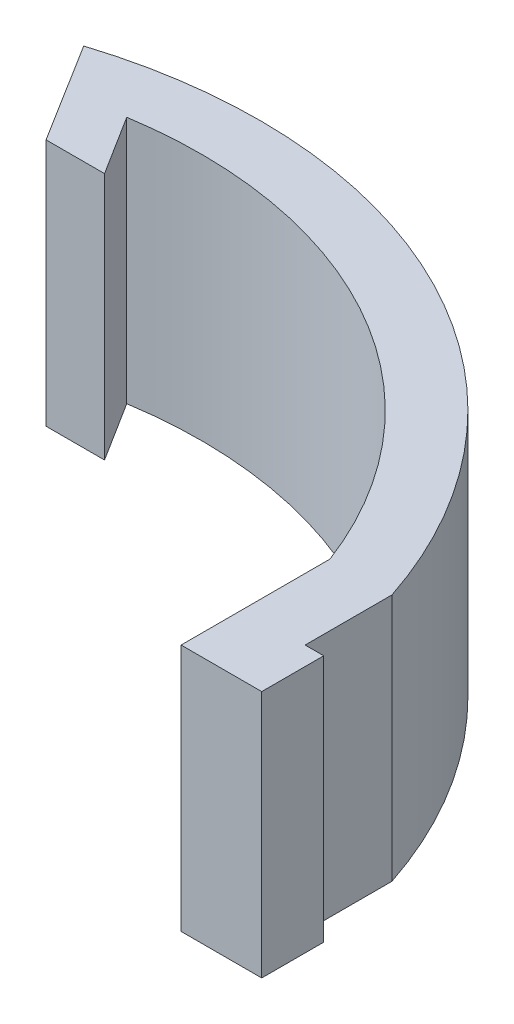
ISO-10303-21;
HEADER;
FILE_DESCRIPTION(('STEP AP214'),'2;1');
FILE_NAME('part.step','',(''),(''),'','','');
FILE_SCHEMA(('AUTOMOTIVE_DESIGN { 1 0 10303 214 1 1 1 1 }'));
ENDSEC;
DATA;
#1=APPLICATION_CONTEXT('core data for automotive mechanical design processes');
#2=APPLICATION_PROTOCOL_DEFINITION('international standard','automotive_design',2000,#1);
#3=PRODUCT_CONTEXT('',#1,'mechanical');
#4=PRODUCT('Part','Part','',(#3));
#5=PRODUCT_RELATED_PRODUCT_CATEGORY('part','',(#4));
#6=PRODUCT_DEFINITION_FORMATION('','',#4);
#7=PRODUCT_DEFINITION_CONTEXT('part definition',#1,'design');
#8=PRODUCT_DEFINITION('design','',#6,#7);
#9=PRODUCT_DEFINITION_SHAPE('','',#8);
#10=(LENGTH_UNIT() NAMED_UNIT(*) SI_UNIT(.MILLI.,.METRE.));
#11=(NAMED_UNIT(*) PLANE_ANGLE_UNIT() SI_UNIT($,.RADIAN.));
#12=(NAMED_UNIT(*) SI_UNIT($,.STERADIAN.) SOLID_ANGLE_UNIT());
#13=UNCERTAINTY_MEASURE_WITH_UNIT(LENGTH_MEASURE(1.E-05),#10,'distance_accuracy_value','');
#14=(GEOMETRIC_REPRESENTATION_CONTEXT(3) GLOBAL_UNCERTAINTY_ASSIGNED_CONTEXT((#13)) GLOBAL_UNIT_ASSIGNED_CONTEXT((#10,
#11,#12)) REPRESENTATION_CONTEXT('',''));
#15=CARTESIAN_POINT('',(0.,0.,0.));
#16=DIRECTION('',(0.,0.,1.));
#17=DIRECTION('',(1.,0.,0.));
#18=AXIS2_PLACEMENT_3D('',#15,#16,#17);
#19=CARTESIAN_POINT('',(13.3217647859869,10.,10.0821639100573));
#20=DIRECTION('',(-1.,0.,0.));
#21=DIRECTION('',(0.,0.,1.));
#22=AXIS2_PLACEMENT_3D('',#19,#20,#21);
#23=PLANE('',#22);
#24=DIRECTION('',(0.,0.,-1.));
#25=VECTOR('',#24,1.);
#26=CARTESIAN_POINT('',(13.3217647859869,0.,10.0821639100573));
#27=LINE('',#26,#25);
#28=CARTESIAN_POINT('',(13.3217647859869,0.,10.0821639100573));
#29=VERTEX_POINT('',#28);
#30=CARTESIAN_POINT('',(13.3217647859869,0.,7.58216391005735));
#31=VERTEX_POINT('',#30);
#32=EDGE_CURVE('E145',#29,#31,#27,.T.);
#33=ORIENTED_EDGE('',*,*,#32,.T.);
#34=DIRECTION('',(0.,-1.,0.));
#35=VECTOR('',#34,1.);
#36=CARTESIAN_POINT('',(13.3217647859869,10.,7.58216391005735));
#37=LINE('',#36,#35);
#38=CARTESIAN_POINT('',(13.3217647859869,10.,7.58216391005735));
#39=VERTEX_POINT('',#38);
#40=EDGE_CURVE('E41',#39,#31,#37,.T.);
#41=ORIENTED_EDGE('',*,*,#40,.F.);
#42=DIRECTION('',(0.,0.,-1.));
#43=VECTOR('',#42,1.);
#44=CARTESIAN_POINT('',(13.3217647859869,10.,10.0821639100573));
#45=LINE('',#44,#43);
#46=CARTESIAN_POINT('',(13.3217647859869,10.,10.0821639100573));
#47=VERTEX_POINT('',#46);
#48=EDGE_CURVE('E99',#47,#39,#45,.T.);
#49=ORIENTED_EDGE('',*,*,#48,.F.);
#50=DIRECTION('',(0.,-1.,0.));
#51=VECTOR('',#50,1.);
#52=CARTESIAN_POINT('',(13.3217647859869,10.,10.0821639100573));
#53=LINE('',#52,#51);
#54=EDGE_CURVE('E11',#47,#29,#53,.T.);
#55=ORIENTED_EDGE('',*,*,#54,.T.);
#56=EDGE_LOOP('',(#33,#41,#49,#55));
#57=FACE_BOUND('',#56,.T.);
#58=ADVANCED_FACE('F33',(#57),#23,.F.);
#59=CARTESIAN_POINT('',(12.5717647859869,10.,7.58216391005735));
#60=DIRECTION('',(0.,0.,1.));
#61=DIRECTION('',(1.,0.,0.));
#62=AXIS2_PLACEMENT_3D('',#59,#60,#61);
#63=PLANE('',#62);
#64=DIRECTION('',(-1.,0.,0.));
#65=VECTOR('',#64,1.);
#66=CARTESIAN_POINT('',(12.5717647859869,0.,7.58216391005735));
#67=LINE('',#66,#65);
#68=CARTESIAN_POINT('',(12.5717647859869,0.,7.58216391005735));
#69=VERTEX_POINT('',#68);
#70=EDGE_CURVE('E147',#31,#69,#67,.T.);
#71=ORIENTED_EDGE('',*,*,#70,.T.);
#72=DIRECTION('',(0.,-1.,0.));
#73=VECTOR('',#72,1.);
#74=CARTESIAN_POINT('',(12.5717647859869,10.,7.58216391005735));
#75=LINE('',#74,#73);
#76=CARTESIAN_POINT('',(12.5717647859869,10.,7.58216391005735));
#77=VERTEX_POINT('',#76);
#78=EDGE_CURVE('E174',#77,#69,#75,.T.);
#79=ORIENTED_EDGE('',*,*,#78,.F.);
#80=DIRECTION('',(-1.,0.,0.));
#81=VECTOR('',#80,1.);
#82=CARTESIAN_POINT('',(12.5717647859869,10.,7.58216391005735));
#83=LINE('',#82,#81);
#84=EDGE_CURVE('E182',#39,#77,#83,.T.);
#85=ORIENTED_EDGE('',*,*,#84,.F.);
#86=ORIENTED_EDGE('',*,*,#40,.T.);
#87=EDGE_LOOP('',(#71,#79,#85,#86));
#88=FACE_BOUND('',#87,.T.);
#89=ADVANCED_FACE('F180',(#88),#63,.F.);
#90=CARTESIAN_POINT('',(12.5717647859869,10.,4.08216391005735));
#91=DIRECTION('',(-1.,0.,0.));
#92=DIRECTION('',(0.,0.,1.));
#93=AXIS2_PLACEMENT_3D('',#90,#91,#92);
#94=PLANE('',#93);
#95=DIRECTION('',(0.,0.,-1.));
#96=VECTOR('',#95,1.);
#97=CARTESIAN_POINT('',(12.5717647859869,0.,4.08216391005735));
#98=LINE('',#97,#96);
#99=CARTESIAN_POINT('',(12.5717647859869,0.,4.08216391005735));
#100=VERTEX_POINT('',#99);
#101=EDGE_CURVE('E149',#69,#100,#98,.T.);
#102=ORIENTED_EDGE('',*,*,#101,.T.);
#103=DIRECTION('',(0.,-1.,0.));
#104=VECTOR('',#103,1.);
#105=CARTESIAN_POINT('',(12.5717647859869,10.,4.08216391005735));
#106=LINE('',#105,#104);
#107=CARTESIAN_POINT('',(12.5717647859869,10.,4.08216391005735));
#108=VERTEX_POINT('',#107);
#109=EDGE_CURVE('E171',#108,#100,#106,.T.);
#110=ORIENTED_EDGE('',*,*,#109,.F.);
#111=DIRECTION('',(0.,0.,-1.));
#112=VECTOR('',#111,1.);
#113=CARTESIAN_POINT('',(12.5717647859869,10.,4.08216391005735));
#114=LINE('',#113,#112);
#115=EDGE_CURVE('E201',#77,#108,#114,.T.);
#116=ORIENTED_EDGE('',*,*,#115,.F.);
#117=ORIENTED_EDGE('',*,*,#78,.T.);
#118=EDGE_LOOP('',(#102,#110,#116,#117));
#119=FACE_BOUND('',#118,.T.);
#120=ADVANCED_FACE('F192',(#119),#94,.F.);
#121=CARTESIAN_POINT('',(-6.65788081712317,10.,10.4244242594253));
#122=DIRECTION('',(0.,-1.,0.));
#123=DIRECTION('',(0.,0.,-1.));
#124=AXIS2_PLACEMENT_3D('',#121,#122,#123);
#125=CYLINDRICAL_SURFACE('',#124,20.2485440553235);
#126=CARTESIAN_POINT('',(-6.65788081712317,0.,10.4244242594253));
#127=DIRECTION('',(0.,1.,0.));
#128=DIRECTION('',(0.,0.,1.));
#129=AXIS2_PLACEMENT_3D('',#126,#127,#128);
#130=CIRCLE('',#129,20.2485440553235);
#131=CARTESIAN_POINT('',(-12.8056765576685,0.,-8.86827238704966));
#132=VERTEX_POINT('',#131);
#133=EDGE_CURVE('E151',#100,#132,#130,.T.);
#134=ORIENTED_EDGE('',*,*,#133,.T.);
#135=DIRECTION('',(0.,-1.,0.));
#136=VECTOR('',#135,1.);
#137=CARTESIAN_POINT('',(-12.8056765576685,10.,-8.86827238704966));
#138=LINE('',#137,#136);
#139=CARTESIAN_POINT('',(-12.8056765576685,10.,-8.86827238704966));
#140=VERTEX_POINT('',#139);
#141=EDGE_CURVE('E168',#140,#132,#138,.T.);
#142=ORIENTED_EDGE('',*,*,#141,.F.);
#143=CARTESIAN_POINT('',(-6.65788081712317,10.,10.4244242594253));
#144=DIRECTION('',(0.,1.,0.));
#145=DIRECTION('',(0.,0.,1.));
#146=AXIS2_PLACEMENT_3D('',#143,#144,#145);
#147=CIRCLE('',#146,20.2485440553235);
#148=EDGE_CURVE('E198',#108,#140,#147,.T.);
#149=ORIENTED_EDGE('',*,*,#148,.F.);
#150=ORIENTED_EDGE('',*,*,#109,.T.);
#151=EDGE_LOOP('',(#134,#142,#149,#150));
#152=FACE_BOUND('',#151,.T.);
#153=ADVANCED_FACE('F196',(#152),#125,.T.);
#154=CARTESIAN_POINT('',(-10.2875702585536,10.,-4.83354103018319));
#155=DIRECTION('',(0.848338398998803,0.,-0.529454399154589));
#156=DIRECTION('',(-0.529454399154589,0.,-0.848338398998803));
#157=AXIS2_PLACEMENT_3D('',#154,#155,#156);
#158=PLANE('',#157);
#159=DIRECTION('',(0.529454399154589,0.,0.848338398998803));
#160=VECTOR('',#159,1.);
#161=CARTESIAN_POINT('',(-10.2875702585536,0.,-4.83354103018319));
#162=LINE('',#161,#160);
#163=CARTESIAN_POINT('',(-10.2875702585536,0.,-4.83354103018319));
#164=VERTEX_POINT('',#163);
#165=EDGE_CURVE('E153',#132,#164,#162,.T.);
#166=ORIENTED_EDGE('',*,*,#165,.T.);
#167=DIRECTION('',(0.,-1.,0.));
#168=VECTOR('',#167,1.);
#169=CARTESIAN_POINT('',(-10.2875702585536,10.,-4.83354103018319));
#170=LINE('',#169,#168);
#171=CARTESIAN_POINT('',(-10.2875702585536,10.,-4.83354103018319));
#172=VERTEX_POINT('',#171);
#173=EDGE_CURVE('E165',#172,#164,#170,.T.);
#174=ORIENTED_EDGE('',*,*,#173,.F.);
#175=DIRECTION('',(0.529454399154589,0.,0.848338398998803));
#176=VECTOR('',#175,1.);
#177=CARTESIAN_POINT('',(-10.2875702585536,10.,-4.83354103018319));
#178=LINE('',#177,#176);
#179=EDGE_CURVE('E200',#140,#172,#178,.T.);
#180=ORIENTED_EDGE('',*,*,#179,.F.);
#181=ORIENTED_EDGE('',*,*,#141,.T.);
#182=EDGE_LOOP('',(#166,#174,#180,#181));
#183=FACE_BOUND('',#182,.T.);
#184=ADVANCED_FACE('F220',(#183),#158,.F.);
#185=CARTESIAN_POINT('',(-7.93002048553808,10.,-4.83354103018319));
#186=DIRECTION('',(0.,0.,-1.));
#187=DIRECTION('',(-1.,0.,0.));
#188=AXIS2_PLACEMENT_3D('',#185,#186,#187);
#189=PLANE('',#188);
#190=DIRECTION('',(1.,0.,0.));
#191=VECTOR('',#190,1.);
#192=CARTESIAN_POINT('',(-7.93002048553808,0.,-4.83354103018319));
#193=LINE('',#192,#191);
#194=CARTESIAN_POINT('',(-7.93002048553808,0.,-4.83354103018319));
#195=VERTEX_POINT('',#194);
#196=EDGE_CURVE('E155',#164,#195,#193,.T.);
#197=ORIENTED_EDGE('',*,*,#196,.T.);
#198=DIRECTION('',(0.,-1.,0.));
#199=VECTOR('',#198,1.);
#200=CARTESIAN_POINT('',(-7.93002048553808,10.,-4.83354103018319));
#201=LINE('',#200,#199);
#202=CARTESIAN_POINT('',(-7.93002048553808,10.,-4.83354103018319));
#203=VERTEX_POINT('',#202);
#204=EDGE_CURVE('E134',#203,#195,#201,.T.);
#205=ORIENTED_EDGE('',*,*,#204,.F.);
#206=DIRECTION('',(1.,0.,0.));
#207=VECTOR('',#206,1.);
#208=CARTESIAN_POINT('',(-7.93002048553808,10.,-4.83354103018319));
#209=LINE('',#208,#207);
#210=EDGE_CURVE('E125',#172,#203,#209,.T.);
#211=ORIENTED_EDGE('',*,*,#210,.F.);
#212=ORIENTED_EDGE('',*,*,#173,.T.);
#213=EDGE_LOOP('',(#197,#205,#211,#212));
#214=FACE_BOUND('',#213,.T.);
#215=ADVANCED_FACE('F223',(#214),#189,.F.);
#216=CARTESIAN_POINT('',(-9.44932987826097,10.,-7.24795872883908));
#217=DIRECTION('',(-0.84637182693609,0.,0.532592461990277));
#218=DIRECTION('',(0.532592461990277,0.,0.84637182693609));
#219=AXIS2_PLACEMENT_3D('',#216,#217,#218);
#220=PLANE('',#219);
#221=DIRECTION('',(-0.532592461990277,0.,-0.846371826936091));
#222=VECTOR('',#221,1.);
#223=CARTESIAN_POINT('',(-9.44932987826097,0.,-7.24795872883908));
#224=LINE('',#223,#222);
#225=CARTESIAN_POINT('',(-9.44932987826096,0.,-7.24795872883908));
#226=VERTEX_POINT('',#225);
#227=EDGE_CURVE('E133',#195,#226,#224,.T.);
#228=ORIENTED_EDGE('',*,*,#227,.T.);
#229=DIRECTION('',(0.,-1.,0.));
#230=VECTOR('',#229,1.);
#231=CARTESIAN_POINT('',(-9.44932987826096,10.,-7.24795872883908));
#232=LINE('',#231,#230);
#233=CARTESIAN_POINT('',(-9.44932987826096,10.,-7.24795872883908));
#234=VERTEX_POINT('',#233);
#235=EDGE_CURVE('E130',#234,#226,#232,.T.);
#236=ORIENTED_EDGE('',*,*,#235,.F.);
#237=DIRECTION('',(-0.532592461990277,0.,-0.846371826936091));
#238=VECTOR('',#237,1.);
#239=CARTESIAN_POINT('',(-9.44932987826097,10.,-7.24795872883908));
#240=LINE('',#239,#238);
#241=EDGE_CURVE('E119',#203,#234,#240,.T.);
#242=ORIENTED_EDGE('',*,*,#241,.F.);
#243=ORIENTED_EDGE('',*,*,#204,.T.);
#244=EDGE_LOOP('',(#228,#236,#242,#243));
#245=FACE_BOUND('',#244,.T.);
#246=ADVANCED_FACE('F131',(#245),#220,.F.);
#247=CARTESIAN_POINT('',(-6.65788081712317,10.,10.4244242594253));
#248=DIRECTION('',(0.,-1.,0.));
#249=DIRECTION('',(0.,0.,-1.));
#250=AXIS2_PLACEMENT_3D('',#247,#248,#249);
#251=CYLINDRICAL_SURFACE('',#250,17.8914870355939);
#252=CARTESIAN_POINT('',(-6.65788081712317,0.,10.4244242594253));
#253=DIRECTION('',(0.,-1.,0.));
#254=DIRECTION('',(0.,0.,1.));
#255=AXIS2_PLACEMENT_3D('',#252,#253,#254);
#256=CIRCLE('',#255,17.8914870355939);
#257=CARTESIAN_POINT('',(10.0717647859869,0.,4.08216391005735));
#258=VERTEX_POINT('',#257);
#259=EDGE_CURVE('E85',#226,#258,#256,.T.);
#260=ORIENTED_EDGE('',*,*,#259,.T.);
#261=DIRECTION('',(0.,-1.,0.));
#262=VECTOR('',#261,1.);
#263=CARTESIAN_POINT('',(10.0717647859869,10.,4.08216391005735));
#264=LINE('',#263,#262);
#265=CARTESIAN_POINT('',(10.0717647859869,10.,4.08216391005735));
#266=VERTEX_POINT('',#265);
#267=EDGE_CURVE('E135',#266,#258,#264,.T.);
#268=ORIENTED_EDGE('',*,*,#267,.F.);
#269=CARTESIAN_POINT('',(-6.65788081712317,10.,10.4244242594253));
#270=DIRECTION('',(0.,-1.,0.));
#271=DIRECTION('',(0.,0.,1.));
#272=AXIS2_PLACEMENT_3D('',#269,#270,#271);
#273=CIRCLE('',#272,17.8914870355939);
#274=EDGE_CURVE('E123',#234,#266,#273,.T.);
#275=ORIENTED_EDGE('',*,*,#274,.F.);
#276=ORIENTED_EDGE('',*,*,#235,.T.);
#277=EDGE_LOOP('',(#260,#268,#275,#276));
#278=FACE_BOUND('',#277,.T.);
#279=ADVANCED_FACE('F137',(#278),#251,.F.);
#280=CARTESIAN_POINT('',(10.0717647859869,10.,10.0821639100573));
#281=DIRECTION('',(1.,0.,0.));
#282=DIRECTION('',(0.,0.,-1.));
#283=AXIS2_PLACEMENT_3D('',#280,#281,#282);
#284=PLANE('',#283);
#285=DIRECTION('',(0.,0.,1.));
#286=VECTOR('',#285,1.);
#287=CARTESIAN_POINT('',(10.0717647859869,0.,10.0821639100573));
#288=LINE('',#287,#286);
#289=CARTESIAN_POINT('',(10.0717647859869,0.,10.0821639100573));
#290=VERTEX_POINT('',#289);
#291=EDGE_CURVE('E92',#258,#290,#288,.T.);
#292=ORIENTED_EDGE('',*,*,#291,.T.);
#293=DIRECTION('',(0.,-1.,0.));
#294=VECTOR('',#293,1.);
#295=CARTESIAN_POINT('',(10.0717647859869,10.,10.0821639100573));
#296=LINE('',#295,#294);
#297=CARTESIAN_POINT('',(10.0717647859869,10.,10.0821639100573));
#298=VERTEX_POINT('',#297);
#299=EDGE_CURVE('E141',#298,#290,#296,.T.);
#300=ORIENTED_EDGE('',*,*,#299,.F.);
#301=DIRECTION('',(0.,0.,1.));
#302=VECTOR('',#301,1.);
#303=CARTESIAN_POINT('',(10.0717647859869,10.,10.0821639100573));
#304=LINE('',#303,#302);
#305=EDGE_CURVE('E139',#266,#298,#304,.T.);
#306=ORIENTED_EDGE('',*,*,#305,.F.);
#307=ORIENTED_EDGE('',*,*,#267,.T.);
#308=EDGE_LOOP('',(#292,#300,#306,#307));
#309=FACE_BOUND('',#308,.T.);
#310=ADVANCED_FACE('F232',(#309),#284,.F.);
#311=CARTESIAN_POINT('',(10.0717647859869,10.,10.0821639100573));
#312=DIRECTION('',(0.,0.,-1.));
#313=DIRECTION('',(-1.,0.,0.));
#314=AXIS2_PLACEMENT_3D('',#311,#312,#313);
#315=PLANE('',#314);
#316=DIRECTION('',(1.,0.,0.));
#317=VECTOR('',#316,1.);
#318=CARTESIAN_POINT('',(10.0717647859869,0.,10.0821639100573));
#319=LINE('',#318,#317);
#320=EDGE_CURVE('E160',#290,#29,#319,.T.);
#321=ORIENTED_EDGE('',*,*,#320,.T.);
#322=ORIENTED_EDGE('',*,*,#54,.F.);
#323=DIRECTION('',(1.,0.,0.));
#324=VECTOR('',#323,1.);
#325=CARTESIAN_POINT('',(12.5717647859869,10.,10.0821639100573));
#326=LINE('',#325,#324);
#327=EDGE_CURVE('E49',#298,#47,#326,.T.);
#328=ORIENTED_EDGE('',*,*,#327,.F.);
#329=ORIENTED_EDGE('',*,*,#299,.T.);
#330=EDGE_LOOP('',(#321,#322,#328,#329));
#331=FACE_BOUND('',#330,.T.);
#332=ADVANCED_FACE('F208',(#331),#315,.F.);
#333=CARTESIAN_POINT('',(-6.65788081712317,10.,10.4244242594253));
#334=DIRECTION('',(0.,1.,0.));
#335=DIRECTION('',(0.,0.,1.));
#336=AXIS2_PLACEMENT_3D('',#333,#334,#335);
#337=PLANE('',#336);
#338=ORIENTED_EDGE('',*,*,#327,.T.);
#339=ORIENTED_EDGE('',*,*,#48,.T.);
#340=ORIENTED_EDGE('',*,*,#84,.T.);
#341=ORIENTED_EDGE('',*,*,#115,.T.);
#342=ORIENTED_EDGE('',*,*,#148,.T.);
#343=ORIENTED_EDGE('',*,*,#179,.T.);
#344=ORIENTED_EDGE('',*,*,#210,.T.);
#345=ORIENTED_EDGE('',*,*,#241,.T.);
#346=ORIENTED_EDGE('',*,*,#274,.T.);
#347=ORIENTED_EDGE('',*,*,#305,.T.);
#348=EDGE_LOOP('',(#338,#339,#340,#341,#342,#343,#344,#345,#346,#347));
#349=FACE_BOUND('',#348,.T.);
#350=ADVANCED_FACE('F121',(#349),#337,.T.);
#351=CARTESIAN_POINT('',(-6.65788081712317,0.,10.4244242594253));
#352=DIRECTION('',(0.,1.,0.));
#353=DIRECTION('',(0.,0.,1.));
#354=AXIS2_PLACEMENT_3D('',#351,#352,#353);
#355=PLANE('',#354);
#356=ORIENTED_EDGE('',*,*,#32,.F.);
#357=ORIENTED_EDGE('',*,*,#320,.F.);
#358=ORIENTED_EDGE('',*,*,#291,.F.);
#359=ORIENTED_EDGE('',*,*,#259,.F.);
#360=ORIENTED_EDGE('',*,*,#227,.F.);
#361=ORIENTED_EDGE('',*,*,#196,.F.);
#362=ORIENTED_EDGE('',*,*,#165,.F.);
#363=ORIENTED_EDGE('',*,*,#133,.F.);
#364=ORIENTED_EDGE('',*,*,#101,.F.);
#365=ORIENTED_EDGE('',*,*,#70,.F.);
#366=EDGE_LOOP('',(#356,#357,#358,#359,#360,#361,#362,#363,#364,#365));
#367=FACE_BOUND('',#366,.T.);
#368=ADVANCED_FACE('F186',(#367),#355,.F.);
#369=CLOSED_SHELL('',(#58,#89,#120,#153,#184,#215,#246,#279,#310,#332,#350,#368));
#370=MANIFOLD_SOLID_BREP('B2',#369);
#371=ADVANCED_BREP_SHAPE_REPRESENTATION('',(#18,#370),#14);
#372=SHAPE_DEFINITION_REPRESENTATION(#9,#371);
ENDSEC;
END-ISO-10303-21;
